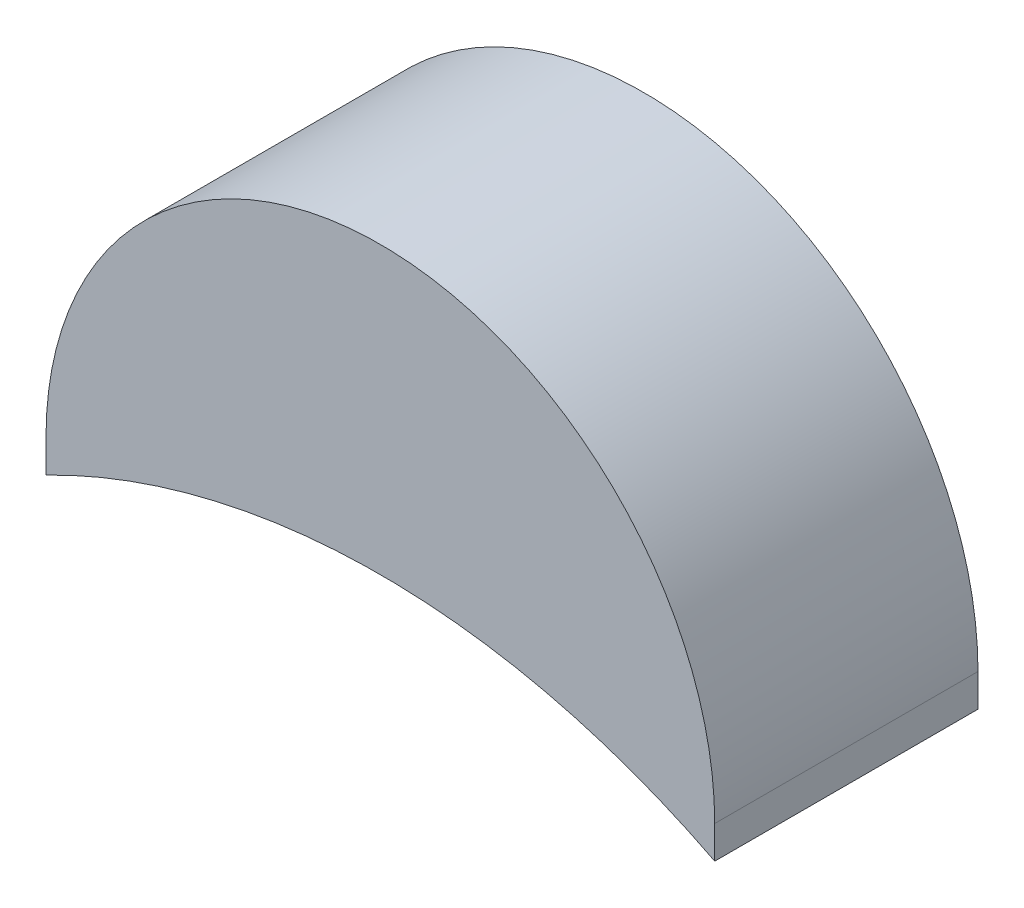
ISO-10303-21;
HEADER;
FILE_DESCRIPTION(('STEP AP214'),'2;1');
FILE_NAME('part.step','',(''),(''),'','','');
FILE_SCHEMA(('AUTOMOTIVE_DESIGN { 1 0 10303 214 1 1 1 1 }'));
ENDSEC;
DATA;
#1=APPLICATION_CONTEXT('core data for automotive mechanical design processes');
#2=APPLICATION_PROTOCOL_DEFINITION('international standard','automotive_design',2000,#1);
#3=PRODUCT_CONTEXT('',#1,'mechanical');
#4=PRODUCT('Part','Part','',(#3));
#5=PRODUCT_RELATED_PRODUCT_CATEGORY('part','',(#4));
#6=PRODUCT_DEFINITION_FORMATION('','',#4);
#7=PRODUCT_DEFINITION_CONTEXT('part definition',#1,'design');
#8=PRODUCT_DEFINITION('design','',#6,#7);
#9=PRODUCT_DEFINITION_SHAPE('','',#8);
#10=(LENGTH_UNIT() NAMED_UNIT(*) SI_UNIT(.MILLI.,.METRE.));
#11=(NAMED_UNIT(*) PLANE_ANGLE_UNIT() SI_UNIT($,.RADIAN.));
#12=(NAMED_UNIT(*) SI_UNIT($,.STERADIAN.) SOLID_ANGLE_UNIT());
#13=UNCERTAINTY_MEASURE_WITH_UNIT(LENGTH_MEASURE(1.E-05),#10,'distance_accuracy_value','');
#14=(GEOMETRIC_REPRESENTATION_CONTEXT(3) GLOBAL_UNCERTAINTY_ASSIGNED_CONTEXT((#13)) GLOBAL_UNIT_ASSIGNED_CONTEXT((#10,
#11,#12)) REPRESENTATION_CONTEXT('',''));
#15=CARTESIAN_POINT('',(0.,0.,0.));
#16=DIRECTION('',(0.,0.,1.));
#17=DIRECTION('',(1.,0.,0.));
#18=AXIS2_PLACEMENT_3D('',#15,#16,#17);
#19=CARTESIAN_POINT('',(109.347,81.2624692908583,0.));
#20=DIRECTION('',(-1.,0.,0.));
#21=DIRECTION('',(0.,1.,0.));
#22=AXIS2_PLACEMENT_3D('',#19,#20,#21);
#23=PLANE('',#22);
#24=DIRECTION('',(0.,1.,0.));
#25=VECTOR('',#24,1.);
#26=CARTESIAN_POINT('',(109.347,80.7690028,0.1999996));
#27=LINE('',#26,#25);
#28=CARTESIAN_POINT('',(109.347,81.2624692908583,0.1999996));
#29=VERTEX_POINT('',#28);
#30=CARTESIAN_POINT('',(109.347,81.2872644,0.1999996));
#31=VERTEX_POINT('',#30);
#32=EDGE_CURVE('E11',#29,#31,#27,.T.);
#33=ORIENTED_EDGE('',*,*,#32,.F.);
#34=DIRECTION('',(0.,0.,1.));
#35=VECTOR('',#34,1.);
#36=CARTESIAN_POINT('',(109.347,81.2624692908583,0.));
#37=LINE('',#36,#35);
#38=CARTESIAN_POINT('',(109.347,81.2624692908583,0.));
#39=VERTEX_POINT('',#38);
#40=EDGE_CURVE('E24',#39,#29,#37,.T.);
#41=ORIENTED_EDGE('',*,*,#40,.F.);
#42=DIRECTION('',(0.,1.,0.));
#43=VECTOR('',#42,1.);
#44=CARTESIAN_POINT('',(109.347,80.7690028,0.));
#45=LINE('',#44,#43);
#46=CARTESIAN_POINT('',(109.347,81.2872644,0.));
#47=VERTEX_POINT('',#46);
#48=EDGE_CURVE('E75',#39,#47,#45,.T.);
#49=ORIENTED_EDGE('',*,*,#48,.T.);
#50=DIRECTION('',(0.,0.,1.));
#51=VECTOR('',#50,1.);
#52=CARTESIAN_POINT('',(109.347,81.2872644,0.));
#53=LINE('',#52,#51);
#54=EDGE_CURVE('E37',#47,#31,#53,.T.);
#55=ORIENTED_EDGE('',*,*,#54,.T.);
#56=EDGE_LOOP('',(#33,#41,#49,#55));
#57=FACE_BOUND('',#56,.T.);
#58=ADVANCED_FACE('F17',(#57),#23,.F.);
#59=CARTESIAN_POINT('',(109.093,81.2872644,0.));
#60=DIRECTION('',(0.,0.,-1.));
#61=DIRECTION('',(1.,0.,0.));
#62=AXIS2_PLACEMENT_3D('',#59,#60,#61);
#63=CYLINDRICAL_SURFACE('',#62,0.253999999999995);
#64=CARTESIAN_POINT('',(109.093,81.2872644,0.1999996));
#65=DIRECTION('',(0.,0.,1.));
#66=DIRECTION('',(1.,0.,0.));
#67=AXIS2_PLACEMENT_3D('',#64,#65,#66);
#68=CIRCLE('',#67,0.253999999999995);
#69=CARTESIAN_POINT('',(108.839,81.2872644,0.1999996));
#70=VERTEX_POINT('',#69);
#71=EDGE_CURVE('E83',#31,#70,#68,.T.);
#72=ORIENTED_EDGE('',*,*,#71,.F.);
#73=ORIENTED_EDGE('',*,*,#54,.F.);
#74=CARTESIAN_POINT('',(109.093,81.2872644,0.));
#75=DIRECTION('',(0.,0.,1.));
#76=DIRECTION('',(1.,0.,0.));
#77=AXIS2_PLACEMENT_3D('',#74,#75,#76);
#78=CIRCLE('',#77,0.253999999999995);
#79=CARTESIAN_POINT('',(108.839,81.2872644,0.));
#80=VERTEX_POINT('',#79);
#81=EDGE_CURVE('E81',#47,#80,#78,.T.);
#82=ORIENTED_EDGE('',*,*,#81,.T.);
#83=DIRECTION('',(0.,0.,1.));
#84=VECTOR('',#83,1.);
#85=CARTESIAN_POINT('',(108.839,81.2872644,0.));
#86=LINE('',#85,#84);
#87=EDGE_CURVE('E67',#80,#70,#86,.T.);
#88=ORIENTED_EDGE('',*,*,#87,.T.);
#89=EDGE_LOOP('',(#72,#73,#82,#88));
#90=FACE_BOUND('',#89,.T.);
#91=ADVANCED_FACE('F89',(#90),#63,.T.);
#92=CARTESIAN_POINT('',(108.839,81.2872644,0.));
#93=DIRECTION('',(1.,0.,0.));
#94=DIRECTION('',(0.,-1.,0.));
#95=AXIS2_PLACEMENT_3D('',#92,#93,#94);
#96=PLANE('',#95);
#97=DIRECTION('',(0.,-1.,0.));
#98=VECTOR('',#97,1.);
#99=CARTESIAN_POINT('',(108.839,81.2872644,0.1999996));
#100=LINE('',#99,#98);
#101=CARTESIAN_POINT('',(108.839,81.2624692908583,0.1999996));
#102=VERTEX_POINT('',#101);
#103=EDGE_CURVE('E71',#70,#102,#100,.T.);
#104=ORIENTED_EDGE('',*,*,#103,.F.);
#105=ORIENTED_EDGE('',*,*,#87,.F.);
#106=DIRECTION('',(0.,-1.,0.));
#107=VECTOR('',#106,1.);
#108=CARTESIAN_POINT('',(108.839,81.2872644,0.));
#109=LINE('',#108,#107);
#110=CARTESIAN_POINT('',(108.839,81.2624692908583,0.));
#111=VERTEX_POINT('',#110);
#112=EDGE_CURVE('E63',#80,#111,#109,.T.);
#113=ORIENTED_EDGE('',*,*,#112,.T.);
#114=DIRECTION('',(0.,0.,1.));
#115=VECTOR('',#114,1.);
#116=CARTESIAN_POINT('',(108.839,81.2624692908583,0.));
#117=LINE('',#116,#115);
#118=EDGE_CURVE('E53',#111,#102,#117,.T.);
#119=ORIENTED_EDGE('',*,*,#118,.T.);
#120=EDGE_LOOP('',(#104,#105,#113,#119));
#121=FACE_BOUND('',#120,.T.);
#122=ADVANCED_FACE('F66',(#121),#96,.F.);
#123=CARTESIAN_POINT('',(109.093,80.7690028,0.));
#124=DIRECTION('',(0.,0.,-1.));
#125=DIRECTION('',(1.,0.,0.));
#126=AXIS2_PLACEMENT_3D('',#123,#124,#125);
#127=CYLINDRICAL_SURFACE('',#126,0.55500016);
#128=ORIENTED_EDGE('',*,*,#40,.T.);
#129=CARTESIAN_POINT('',(109.093,80.7690028,0.1999996));
#130=DIRECTION('',(0.,0.,1.));
#131=DIRECTION('',(1.,0.,0.));
#132=AXIS2_PLACEMENT_3D('',#129,#130,#131);
#133=CIRCLE('',#132,0.55500016);
#134=EDGE_CURVE('E59',#29,#102,#133,.T.);
#135=ORIENTED_EDGE('',*,*,#134,.T.);
#136=ORIENTED_EDGE('',*,*,#118,.F.);
#137=CARTESIAN_POINT('',(109.093,80.7690028,0.));
#138=DIRECTION('',(0.,0.,1.));
#139=DIRECTION('',(1.,0.,0.));
#140=AXIS2_PLACEMENT_3D('',#137,#138,#139);
#141=CIRCLE('',#140,0.55500016);
#142=EDGE_CURVE('E57',#39,#111,#141,.T.);
#143=ORIENTED_EDGE('',*,*,#142,.F.);
#144=EDGE_LOOP('',(#128,#135,#136,#143));
#145=FACE_BOUND('',#144,.T.);
#146=ADVANCED_FACE('F55',(#145),#127,.F.);
#147=CARTESIAN_POINT('',(109.347,80.7690028,0.));
#148=DIRECTION('',(0.,0.,-1.));
#149=DIRECTION('',(-1.,0.,0.));
#150=AXIS2_PLACEMENT_3D('',#147,#148,#149);
#151=PLANE('',#150);
#152=ORIENTED_EDGE('',*,*,#48,.F.);
#153=ORIENTED_EDGE('',*,*,#142,.T.);
#154=ORIENTED_EDGE('',*,*,#112,.F.);
#155=ORIENTED_EDGE('',*,*,#81,.F.);
#156=EDGE_LOOP('',(#152,#153,#154,#155));
#157=FACE_BOUND('',#156,.T.);
#158=ADVANCED_FACE('F74',(#157),#151,.T.);
#159=CARTESIAN_POINT('',(109.347,80.7690028,0.1999996));
#160=DIRECTION('',(0.,0.,-1.));
#161=DIRECTION('',(-1.,0.,0.));
#162=AXIS2_PLACEMENT_3D('',#159,#160,#161);
#163=PLANE('',#162);
#164=ORIENTED_EDGE('',*,*,#134,.F.);
#165=ORIENTED_EDGE('',*,*,#32,.T.);
#166=ORIENTED_EDGE('',*,*,#71,.T.);
#167=ORIENTED_EDGE('',*,*,#103,.T.);
#168=EDGE_LOOP('',(#164,#165,#166,#167));
#169=FACE_BOUND('',#168,.T.);
#170=ADVANCED_FACE('F91',(#169),#163,.F.);
#171=CLOSED_SHELL('',(#58,#91,#122,#146,#158,#170));
#172=MANIFOLD_SOLID_BREP('B1',#171);
#173=ADVANCED_BREP_SHAPE_REPRESENTATION('',(#18,#172),#14);
#174=SHAPE_DEFINITION_REPRESENTATION(#9,#173);
ENDSEC;
END-ISO-10303-21;
